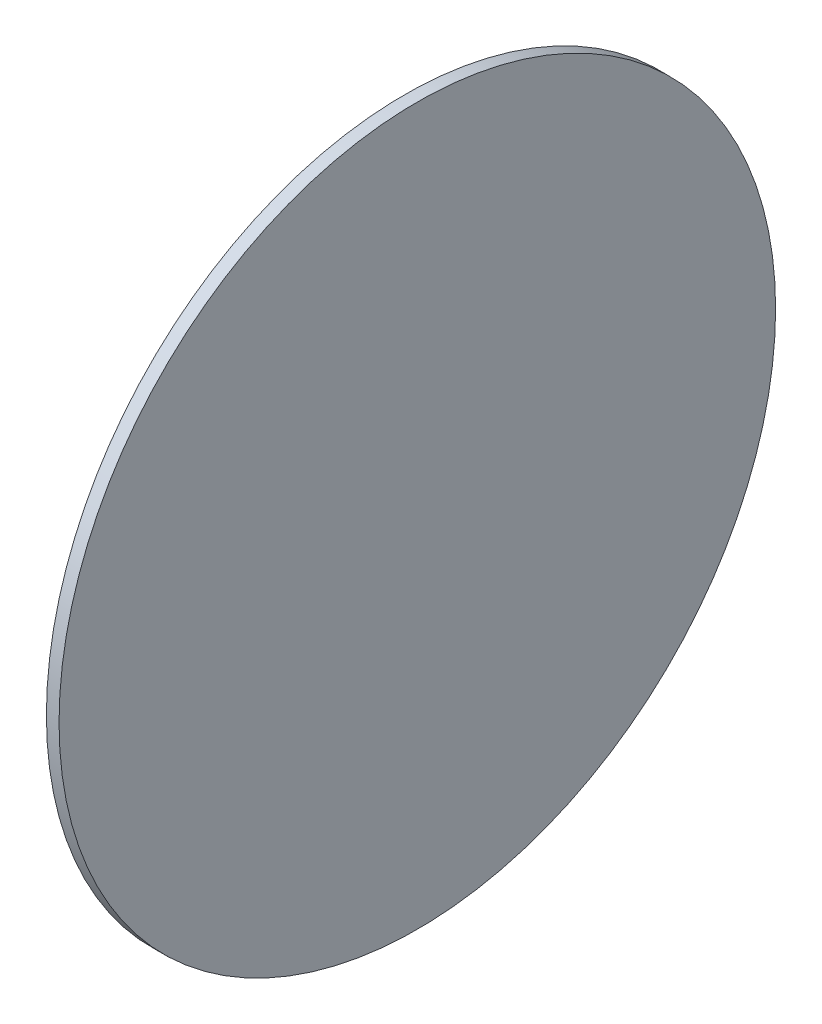
ISO-10303-21;
HEADER;
FILE_DESCRIPTION(('STEP AP214'),'2;1');
FILE_NAME('part.step','',(''),(''),'','','');
FILE_SCHEMA(('AUTOMOTIVE_DESIGN { 1 0 10303 214 1 1 1 1 }'));
ENDSEC;
DATA;
#1=APPLICATION_CONTEXT('core data for automotive mechanical design processes');
#2=APPLICATION_PROTOCOL_DEFINITION('international standard','automotive_design',2000,#1);
#3=PRODUCT_CONTEXT('',#1,'mechanical');
#4=PRODUCT('Part','Part','',(#3));
#5=PRODUCT_RELATED_PRODUCT_CATEGORY('part','',(#4));
#6=PRODUCT_DEFINITION_FORMATION('','',#4);
#7=PRODUCT_DEFINITION_CONTEXT('part definition',#1,'design');
#8=PRODUCT_DEFINITION('design','',#6,#7);
#9=PRODUCT_DEFINITION_SHAPE('','',#8);
#10=(LENGTH_UNIT() NAMED_UNIT(*) SI_UNIT(.MILLI.,.METRE.));
#11=(NAMED_UNIT(*) PLANE_ANGLE_UNIT() SI_UNIT($,.RADIAN.));
#12=(NAMED_UNIT(*) SI_UNIT($,.STERADIAN.) SOLID_ANGLE_UNIT());
#13=UNCERTAINTY_MEASURE_WITH_UNIT(LENGTH_MEASURE(1.E-05),#10,'distance_accuracy_value','');
#14=(GEOMETRIC_REPRESENTATION_CONTEXT(3) GLOBAL_UNCERTAINTY_ASSIGNED_CONTEXT((#13)) GLOBAL_UNIT_ASSIGNED_CONTEXT((#10,
#11,#12)) REPRESENTATION_CONTEXT('',''));
#15=CARTESIAN_POINT('',(0.,0.,0.));
#16=DIRECTION('',(0.,0.,1.));
#17=DIRECTION('',(1.,0.,0.));
#18=AXIS2_PLACEMENT_3D('',#15,#16,#17);
#19=CARTESIAN_POINT('',(1.8,0.,0.));
#20=DIRECTION('',(-1.,0.,0.));
#21=DIRECTION('',(0.,0.,1.));
#22=AXIS2_PLACEMENT_3D('',#19,#20,#21);
#23=CYLINDRICAL_SURFACE('',#22,51.);
#24=CARTESIAN_POINT('',(1.8,0.,0.));
#25=DIRECTION('',(1.,0.,0.));
#26=DIRECTION('',(0.,0.,-1.));
#27=AXIS2_PLACEMENT_3D('',#24,#25,#26);
#28=CIRCLE('',#27,51.);
#29=CARTESIAN_POINT('',(1.8,0.,-51.));
#30=VERTEX_POINT('',#29);
#31=EDGE_CURVE('E10',#30,#30,#28,.T.);
#32=ORIENTED_EDGE('',*,*,#31,.F.);
#33=EDGE_LOOP('',(#32));
#34=FACE_BOUND('',#33,.T.);
#35=CARTESIAN_POINT('',(0.,0.,0.));
#36=DIRECTION('',(1.,0.,0.));
#37=DIRECTION('',(0.,0.,-1.));
#38=AXIS2_PLACEMENT_3D('',#35,#36,#37);
#39=CIRCLE('',#38,51.);
#40=CARTESIAN_POINT('',(0.,0.,-51.));
#41=VERTEX_POINT('',#40);
#42=EDGE_CURVE('E38',#41,#41,#39,.T.);
#43=ORIENTED_EDGE('',*,*,#42,.T.);
#44=EDGE_LOOP('',(#43));
#45=FACE_BOUND('',#44,.T.);
#46=ADVANCED_FACE('F35',(#34,#45),#23,.T.);
#47=CARTESIAN_POINT('',(1.8,0.,0.));
#48=DIRECTION('',(1.,0.,0.));
#49=DIRECTION('',(0.,0.,-1.));
#50=AXIS2_PLACEMENT_3D('',#47,#48,#49);
#51=PLANE('',#50);
#52=ORIENTED_EDGE('',*,*,#31,.T.);
#53=EDGE_LOOP('',(#52));
#54=FACE_BOUND('',#53,.T.);
#55=ADVANCED_FACE('F50',(#54),#51,.T.);
#56=CARTESIAN_POINT('',(0.,0.,0.));
#57=DIRECTION('',(1.,0.,0.));
#58=DIRECTION('',(0.,0.,-1.));
#59=AXIS2_PLACEMENT_3D('',#56,#57,#58);
#60=PLANE('',#59);
#61=ORIENTED_EDGE('',*,*,#42,.F.);
#62=EDGE_LOOP('',(#61));
#63=FACE_BOUND('',#62,.T.);
#64=ADVANCED_FACE('F48',(#63),#60,.F.);
#65=CLOSED_SHELL('',(#46,#55,#64));
#66=MANIFOLD_SOLID_BREP('B2',#65);
#67=ADVANCED_BREP_SHAPE_REPRESENTATION('',(#18,#66),#14);
#68=SHAPE_DEFINITION_REPRESENTATION(#9,#67);
ENDSEC;
END-ISO-10303-21;
